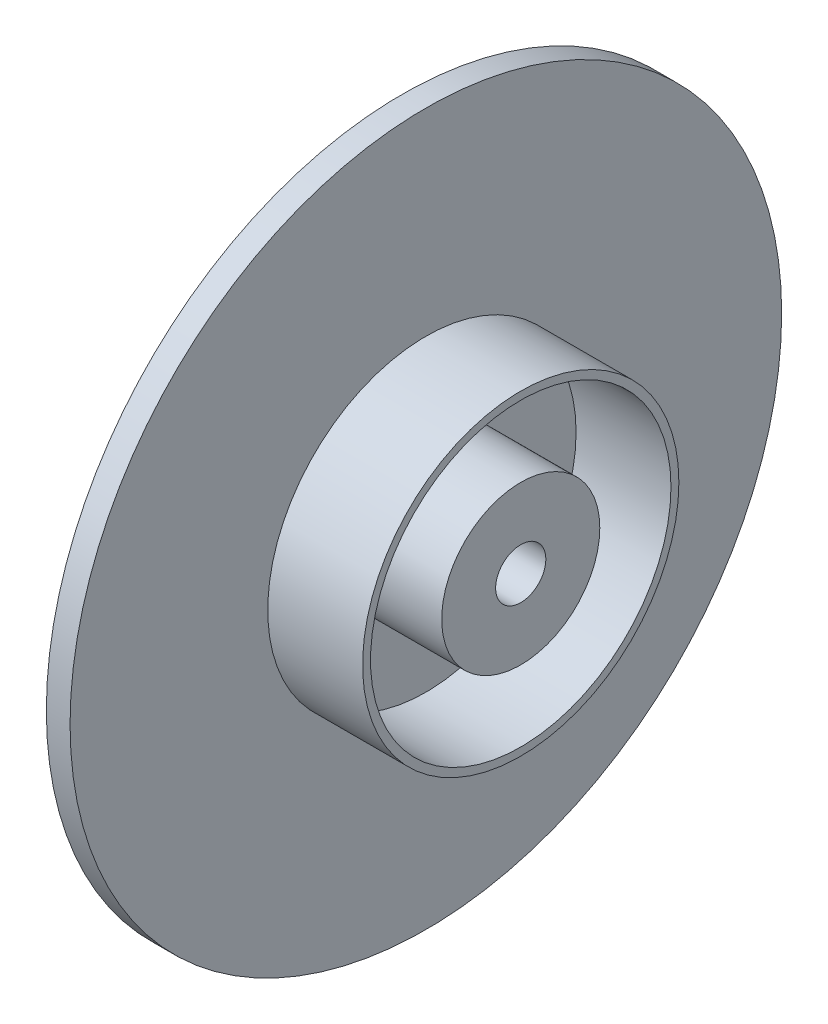
ISO-10303-21;
HEADER;
FILE_DESCRIPTION(('STEP AP214'),'2;1');
FILE_NAME('part.step','',(''),(''),'','','');
FILE_SCHEMA(('AUTOMOTIVE_DESIGN { 1 0 10303 214 1 1 1 1 }'));
ENDSEC;
DATA;
#1=APPLICATION_CONTEXT('core data for automotive mechanical design processes');
#2=APPLICATION_PROTOCOL_DEFINITION('international standard','automotive_design',2000,#1);
#3=PRODUCT_CONTEXT('',#1,'mechanical');
#4=PRODUCT('Part','Part','',(#3));
#5=PRODUCT_RELATED_PRODUCT_CATEGORY('part','',(#4));
#6=PRODUCT_DEFINITION_FORMATION('','',#4);
#7=PRODUCT_DEFINITION_CONTEXT('part definition',#1,'design');
#8=PRODUCT_DEFINITION('design','',#6,#7);
#9=PRODUCT_DEFINITION_SHAPE('','',#8);
#10=(LENGTH_UNIT() NAMED_UNIT(*) SI_UNIT(.MILLI.,.METRE.));
#11=(NAMED_UNIT(*) PLANE_ANGLE_UNIT() SI_UNIT($,.RADIAN.));
#12=(NAMED_UNIT(*) SI_UNIT($,.STERADIAN.) SOLID_ANGLE_UNIT());
#13=UNCERTAINTY_MEASURE_WITH_UNIT(LENGTH_MEASURE(1.E-05),#10,'distance_accuracy_value','');
#14=(GEOMETRIC_REPRESENTATION_CONTEXT(3) GLOBAL_UNCERTAINTY_ASSIGNED_CONTEXT((#13)) GLOBAL_UNIT_ASSIGNED_CONTEXT((#10,
#11,#12)) REPRESENTATION_CONTEXT('',''));
#15=CARTESIAN_POINT('',(0.,0.,0.));
#16=DIRECTION('',(0.,0.,1.));
#17=DIRECTION('',(1.,0.,0.));
#18=AXIS2_PLACEMENT_3D('',#15,#16,#17);
#19=CARTESIAN_POINT('',(3.01133107184446,0.,0.));
#20=DIRECTION('',(-1.,0.,0.));
#21=DIRECTION('',(0.,0.,1.));
#22=AXIS2_PLACEMENT_3D('',#19,#20,#21);
#23=CYLINDRICAL_SURFACE('',#22,27.);
#24=CARTESIAN_POINT('',(3.01133107184446,0.,0.));
#25=DIRECTION('',(1.,0.,0.));
#26=DIRECTION('',(0.,0.,-1.));
#27=AXIS2_PLACEMENT_3D('',#24,#25,#26);
#28=CIRCLE('',#27,27.);
#29=CARTESIAN_POINT('',(3.01133107184446,0.,-27.));
#30=VERTEX_POINT('',#29);
#31=EDGE_CURVE('E43',#30,#30,#28,.T.);
#32=ORIENTED_EDGE('',*,*,#31,.F.);
#33=EDGE_LOOP('',(#32));
#34=FACE_BOUND('',#33,.T.);
#35=CARTESIAN_POINT('',(1.21133107184446,0.,0.));
#36=DIRECTION('',(1.,0.,0.));
#37=DIRECTION('',(0.,0.,-1.));
#38=AXIS2_PLACEMENT_3D('',#35,#36,#37);
#39=CIRCLE('',#38,27.);
#40=CARTESIAN_POINT('',(1.21133107184446,0.,-27.));
#41=VERTEX_POINT('',#40);
#42=EDGE_CURVE('E47',#41,#41,#39,.T.);
#43=ORIENTED_EDGE('',*,*,#42,.T.);
#44=EDGE_LOOP('',(#43));
#45=FACE_BOUND('',#44,.T.);
#46=ADVANCED_FACE('F37',(#34,#45),#23,.T.);
#47=CARTESIAN_POINT('',(3.01133107184446,0.,0.));
#48=DIRECTION('',(1.,0.,0.));
#49=DIRECTION('',(0.,0.,-1.));
#50=AXIS2_PLACEMENT_3D('',#47,#48,#49);
#51=PLANE('',#50);
#52=CARTESIAN_POINT('',(3.01133107184446,0.,0.));
#53=DIRECTION('',(1.,0.,0.));
#54=DIRECTION('',(0.,0.,-1.));
#55=AXIS2_PLACEMENT_3D('',#52,#53,#54);
#56=CIRCLE('',#55,12.);
#57=CARTESIAN_POINT('',(3.01133107184446,0.,-12.));
#58=VERTEX_POINT('',#57);
#59=EDGE_CURVE('E60',#58,#58,#56,.T.);
#60=ORIENTED_EDGE('',*,*,#59,.F.);
#61=EDGE_LOOP('',(#60));
#62=FACE_BOUND('',#61,.T.);
#63=ORIENTED_EDGE('',*,*,#31,.T.);
#64=EDGE_LOOP('',(#63));
#65=FACE_BOUND('',#64,.T.);
#66=ADVANCED_FACE('F101',(#62,#65),#51,.T.);
#67=CARTESIAN_POINT('',(1.21133107184446,0.,0.));
#68=DIRECTION('',(1.,0.,0.));
#69=DIRECTION('',(0.,0.,-1.));
#70=AXIS2_PLACEMENT_3D('',#67,#68,#69);
#71=PLANE('',#70);
#72=CARTESIAN_POINT('',(1.21133107184446,0.,0.));
#73=DIRECTION('',(1.,0.,0.));
#74=DIRECTION('',(0.,0.,-1.));
#75=AXIS2_PLACEMENT_3D('',#72,#73,#74);
#76=CIRCLE('',#75,1.905);
#77=CARTESIAN_POINT('',(1.21133107184446,0.,-1.905));
#78=VERTEX_POINT('',#77);
#79=EDGE_CURVE('E68',#78,#78,#76,.T.);
#80=ORIENTED_EDGE('',*,*,#79,.T.);
#81=EDGE_LOOP('',(#80));
#82=FACE_BOUND('',#81,.T.);
#83=ORIENTED_EDGE('',*,*,#42,.F.);
#84=EDGE_LOOP('',(#83));
#85=FACE_BOUND('',#84,.T.);
#86=ADVANCED_FACE('F75',(#82,#85),#71,.F.);
#87=CARTESIAN_POINT('',(10.2113310718445,0.,0.));
#88=DIRECTION('',(1.,0.,0.));
#89=DIRECTION('',(0.,0.,-1.));
#90=AXIS2_PLACEMENT_3D('',#87,#88,#89);
#91=PLANE('',#90);
#92=CARTESIAN_POINT('',(10.2113310718445,0.,0.));
#93=DIRECTION('',(1.,0.,0.));
#94=DIRECTION('',(0.,0.,-1.));
#95=AXIS2_PLACEMENT_3D('',#92,#93,#94);
#96=CIRCLE('',#95,12.);
#97=CARTESIAN_POINT('',(10.2113310718445,0.,-12.));
#98=VERTEX_POINT('',#97);
#99=EDGE_CURVE('E57',#98,#98,#96,.T.);
#100=ORIENTED_EDGE('',*,*,#99,.T.);
#101=EDGE_LOOP('',(#100));
#102=FACE_BOUND('',#101,.T.);
#103=CARTESIAN_POINT('',(10.2113310718445,0.,0.));
#104=DIRECTION('',(1.,0.,0.));
#105=DIRECTION('',(0.,0.,-1.));
#106=AXIS2_PLACEMENT_3D('',#103,#104,#105);
#107=CIRCLE('',#106,11.4);
#108=CARTESIAN_POINT('',(10.2113310718445,0.,-11.4));
#109=VERTEX_POINT('',#108);
#110=EDGE_CURVE('E63',#109,#109,#107,.T.);
#111=ORIENTED_EDGE('',*,*,#110,.F.);
#112=EDGE_LOOP('',(#111));
#113=FACE_BOUND('',#112,.T.);
#114=ADVANCED_FACE('F113',(#102,#113),#91,.T.);
#115=CARTESIAN_POINT('',(10.2113310718445,0.,0.));
#116=DIRECTION('',(-1.,0.,0.));
#117=DIRECTION('',(0.,0.,1.));
#118=AXIS2_PLACEMENT_3D('',#115,#116,#117);
#119=CYLINDRICAL_SURFACE('',#118,12.);
#120=ORIENTED_EDGE('',*,*,#99,.F.);
#121=EDGE_LOOP('',(#120));
#122=FACE_BOUND('',#121,.T.);
#123=ORIENTED_EDGE('',*,*,#59,.T.);
#124=EDGE_LOOP('',(#123));
#125=FACE_BOUND('',#124,.T.);
#126=ADVANCED_FACE('F117',(#122,#125),#119,.T.);
#127=CARTESIAN_POINT('',(10.2113310718445,0.,0.));
#128=DIRECTION('',(-1.,0.,0.));
#129=DIRECTION('',(0.,0.,1.));
#130=AXIS2_PLACEMENT_3D('',#127,#128,#129);
#131=CYLINDRICAL_SURFACE('',#130,11.4);
#132=ORIENTED_EDGE('',*,*,#110,.T.);
#133=EDGE_LOOP('',(#132));
#134=FACE_BOUND('',#133,.T.);
#135=CARTESIAN_POINT('',(3.01133107184446,0.,0.));
#136=DIRECTION('',(1.,0.,0.));
#137=DIRECTION('',(0.,0.,-1.));
#138=AXIS2_PLACEMENT_3D('',#135,#136,#137);
#139=CIRCLE('',#138,11.4);
#140=CARTESIAN_POINT('',(3.01133107184446,0.,-11.4));
#141=VERTEX_POINT('',#140);
#142=EDGE_CURVE('E10',#141,#141,#139,.F.);
#143=ORIENTED_EDGE('',*,*,#142,.T.);
#144=EDGE_LOOP('',(#143));
#145=FACE_BOUND('',#144,.T.);
#146=ADVANCED_FACE('F89',(#134,#145),#131,.F.);
#147=CARTESIAN_POINT('',(10.2113310718445,0.,0.));
#148=DIRECTION('',(1.,0.,0.));
#149=DIRECTION('',(0.,0.,-1.));
#150=AXIS2_PLACEMENT_3D('',#147,#148,#149);
#151=PLANE('',#150);
#152=CARTESIAN_POINT('',(10.2113310718445,0.,0.));
#153=DIRECTION('',(1.,0.,0.));
#154=DIRECTION('',(0.,0.,-1.));
#155=AXIS2_PLACEMENT_3D('',#152,#153,#154);
#156=CIRCLE('',#155,1.905);
#157=CARTESIAN_POINT('',(10.2113310718445,0.,-1.905));
#158=VERTEX_POINT('',#157);
#159=EDGE_CURVE('E69',#158,#158,#156,.T.);
#160=ORIENTED_EDGE('',*,*,#159,.F.);
#161=EDGE_LOOP('',(#160));
#162=FACE_BOUND('',#161,.T.);
#163=CARTESIAN_POINT('',(10.2113310718445,0.,0.));
#164=DIRECTION('',(1.,0.,0.));
#165=DIRECTION('',(0.,0.,-1.));
#166=AXIS2_PLACEMENT_3D('',#163,#164,#165);
#167=CIRCLE('',#166,6.);
#168=CARTESIAN_POINT('',(10.2113310718445,0.,-6.));
#169=VERTEX_POINT('',#168);
#170=EDGE_CURVE('E52',#169,#169,#167,.T.);
#171=ORIENTED_EDGE('',*,*,#170,.T.);
#172=EDGE_LOOP('',(#171));
#173=FACE_BOUND('',#172,.T.);
#174=ADVANCED_FACE('F85',(#162,#173),#151,.T.);
#175=CARTESIAN_POINT('',(10.2113310718445,0.,0.));
#176=DIRECTION('',(-1.,0.,0.));
#177=DIRECTION('',(0.,0.,1.));
#178=AXIS2_PLACEMENT_3D('',#175,#176,#177);
#179=CYLINDRICAL_SURFACE('',#178,6.);
#180=ORIENTED_EDGE('',*,*,#170,.F.);
#181=EDGE_LOOP('',(#180));
#182=FACE_BOUND('',#181,.T.);
#183=CARTESIAN_POINT('',(3.01133107184446,0.,0.));
#184=DIRECTION('',(1.,0.,0.));
#185=DIRECTION('',(0.,0.,-1.));
#186=AXIS2_PLACEMENT_3D('',#183,#184,#185);
#187=CIRCLE('',#186,6.);
#188=CARTESIAN_POINT('',(3.01133107184446,0.,-6.));
#189=VERTEX_POINT('',#188);
#190=EDGE_CURVE('E54',#189,#189,#187,.T.);
#191=ORIENTED_EDGE('',*,*,#190,.T.);
#192=EDGE_LOOP('',(#191));
#193=FACE_BOUND('',#192,.T.);
#194=ADVANCED_FACE('F88',(#182,#193),#179,.T.);
#195=ORIENTED_EDGE('',*,*,#190,.F.);
#196=EDGE_LOOP('',(#195));
#197=FACE_BOUND('',#196,.T.);
#198=ORIENTED_EDGE('',*,*,#142,.F.);
#199=EDGE_LOOP('',(#198));
#200=FACE_BOUND('',#199,.T.);
#201=ADVANCED_FACE('F81',(#197,#200),#51,.T.);
#202=CARTESIAN_POINT('',(1.21133107184446,0.,0.));
#203=DIRECTION('',(1.,0.,0.));
#204=DIRECTION('',(0.,0.,-1.));
#205=AXIS2_PLACEMENT_3D('',#202,#203,#204);
#206=CYLINDRICAL_SURFACE('',#205,1.905);
#207=ORIENTED_EDGE('',*,*,#79,.F.);
#208=EDGE_LOOP('',(#207));
#209=FACE_BOUND('',#208,.T.);
#210=ORIENTED_EDGE('',*,*,#159,.T.);
#211=EDGE_LOOP('',(#210));
#212=FACE_BOUND('',#211,.T.);
#213=ADVANCED_FACE('F78',(#209,#212),#206,.F.);
#214=CLOSED_SHELL('',(#46,#66,#86,#114,#126,#146,#174,#194,#201,#213));
#215=MANIFOLD_SOLID_BREP('B2',#214);
#216=ADVANCED_BREP_SHAPE_REPRESENTATION('',(#18,#215),#14);
#217=SHAPE_DEFINITION_REPRESENTATION(#9,#216);
ENDSEC;
END-ISO-10303-21;
